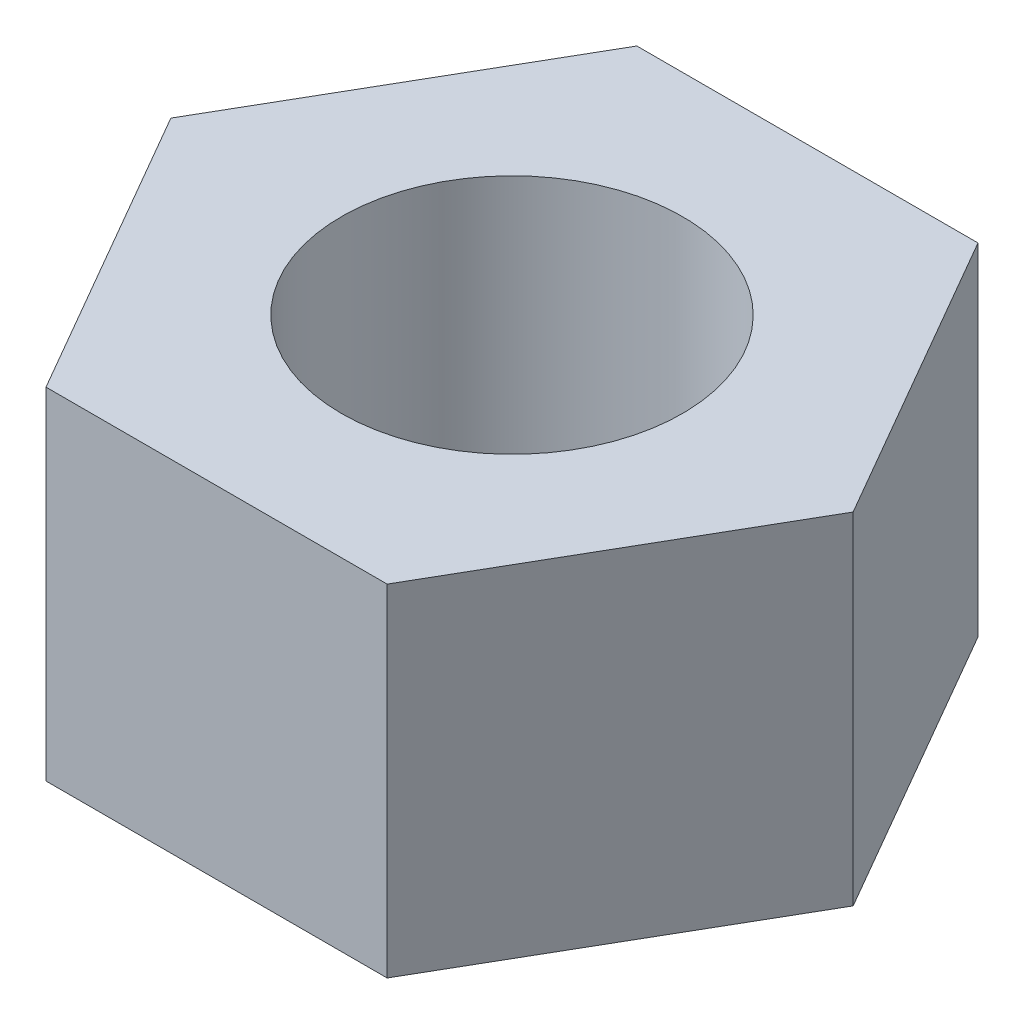
ISO-10303-21;
HEADER;
FILE_DESCRIPTION(('STEP AP214'),'2;1');
FILE_NAME('part.step','',(''),(''),'','','');
FILE_SCHEMA(('AUTOMOTIVE_DESIGN { 1 0 10303 214 1 1 1 1 }'));
ENDSEC;
DATA;
#1=APPLICATION_CONTEXT('core data for automotive mechanical design processes');
#2=APPLICATION_PROTOCOL_DEFINITION('international standard','automotive_design',2000,#1);
#3=PRODUCT_CONTEXT('',#1,'mechanical');
#4=PRODUCT('Part','Part','',(#3));
#5=PRODUCT_RELATED_PRODUCT_CATEGORY('part','',(#4));
#6=PRODUCT_DEFINITION_FORMATION('','',#4);
#7=PRODUCT_DEFINITION_CONTEXT('part definition',#1,'design');
#8=PRODUCT_DEFINITION('design','',#6,#7);
#9=PRODUCT_DEFINITION_SHAPE('','',#8);
#10=(LENGTH_UNIT() NAMED_UNIT(*) SI_UNIT(.MILLI.,.METRE.));
#11=(NAMED_UNIT(*) PLANE_ANGLE_UNIT() SI_UNIT($,.RADIAN.));
#12=(NAMED_UNIT(*) SI_UNIT($,.STERADIAN.) SOLID_ANGLE_UNIT());
#13=UNCERTAINTY_MEASURE_WITH_UNIT(LENGTH_MEASURE(1.E-05),#10,'distance_accuracy_value','');
#14=(GEOMETRIC_REPRESENTATION_CONTEXT(3) GLOBAL_UNCERTAINTY_ASSIGNED_CONTEXT((#13)) GLOBAL_UNIT_ASSIGNED_CONTEXT((#10,
#11,#12)) REPRESENTATION_CONTEXT('',''));
#15=CARTESIAN_POINT('',(0.,0.,0.));
#16=DIRECTION('',(0.,0.,1.));
#17=DIRECTION('',(1.,0.,0.));
#18=AXIS2_PLACEMENT_3D('',#15,#16,#17);
#19=CARTESIAN_POINT('',(0.,20.,0.));
#20=DIRECTION('',(0.,-1.,0.));
#21=DIRECTION('',(0.,0.,-1.));
#22=AXIS2_PLACEMENT_3D('',#19,#20,#21);
#23=PLANE('',#22);
#24=DIRECTION('',(-0.499999999999992,0.,0.866025403784443));
#25=VECTOR('',#24,1.);
#26=CARTESIAN_POINT('',(-10.0000000000003,20.,-17.3205080756887));
#27=LINE('',#26,#25);
#28=CARTESIAN_POINT('',(-10.0000000000003,20.,-17.3205080756887));
#29=VERTEX_POINT('',#28);
#30=CARTESIAN_POINT('',(-20.0000000000001,20.,1.45716771982052E-13));
#31=VERTEX_POINT('',#30);
#32=EDGE_CURVE('E129',#29,#31,#27,.T.);
#33=ORIENTED_EDGE('',*,*,#32,.T.);
#34=DIRECTION('',(0.500000000000018,0.,0.866025403784429));
#35=VECTOR('',#34,1.);
#36=CARTESIAN_POINT('',(-9.99999999999974,20.,17.3205080756887));
#37=LINE('',#36,#35);
#38=CARTESIAN_POINT('',(-9.99999999999974,20.,17.3205080756887));
#39=VERTEX_POINT('',#38);
#40=EDGE_CURVE('E87',#31,#39,#37,.T.);
#41=ORIENTED_EDGE('',*,*,#40,.T.);
#42=DIRECTION('',(1.,0.,0.));
#43=VECTOR('',#42,1.);
#44=CARTESIAN_POINT('',(10.0000000000003,20.,17.3205080756887));
#45=LINE('',#44,#43);
#46=CARTESIAN_POINT('',(10.0000000000003,20.,17.3205080756887));
#47=VERTEX_POINT('',#46);
#48=EDGE_CURVE('E100',#39,#47,#45,.T.);
#49=ORIENTED_EDGE('',*,*,#48,.T.);
#50=DIRECTION('',(0.499999999999992,0.,-0.866025403784443));
#51=VECTOR('',#50,1.);
#52=CARTESIAN_POINT('',(20.0000000000001,20.,-1.45716771982052E-13));
#53=LINE('',#52,#51);
#54=CARTESIAN_POINT('',(20.0000000000001,20.,-1.45716771982052E-13));
#55=VERTEX_POINT('',#54);
#56=EDGE_CURVE('E94',#47,#55,#53,.T.);
#57=ORIENTED_EDGE('',*,*,#56,.T.);
#58=DIRECTION('',(-0.500000000000018,0.,-0.866025403784428));
#59=VECTOR('',#58,1.);
#60=CARTESIAN_POINT('',(9.99999999999974,20.,-17.3205080756887));
#61=LINE('',#60,#59);
#62=CARTESIAN_POINT('',(9.99999999999974,20.,-17.3205080756887));
#63=VERTEX_POINT('',#62);
#64=EDGE_CURVE('E98',#55,#63,#61,.T.);
#65=ORIENTED_EDGE('',*,*,#64,.T.);
#66=DIRECTION('',(-1.,0.,0.));
#67=VECTOR('',#66,1.);
#68=CARTESIAN_POINT('',(-10.0000000000003,20.,-17.3205080756887));
#69=LINE('',#68,#67);
#70=EDGE_CURVE('E50',#63,#29,#69,.T.);
#71=ORIENTED_EDGE('',*,*,#70,.T.);
#72=EDGE_LOOP('',(#33,#41,#49,#57,#65,#71));
#73=FACE_BOUND('',#72,.T.);
#74=CARTESIAN_POINT('',(0.,20.,0.));
#75=DIRECTION('',(0.,1.,0.));
#76=DIRECTION('',(0.,0.,1.));
#77=AXIS2_PLACEMENT_3D('',#74,#75,#76);
#78=CIRCLE('',#77,10.);
#79=CARTESIAN_POINT('',(0.,20.,10.));
#80=VERTEX_POINT('',#79);
#81=EDGE_CURVE('E122',#80,#80,#78,.T.);
#82=ORIENTED_EDGE('',*,*,#81,.F.);
#83=EDGE_LOOP('',(#82));
#84=FACE_BOUND('',#83,.T.);
#85=ADVANCED_FACE('F33',(#73,#84),#23,.F.);
#86=CARTESIAN_POINT('',(0.,0.,0.));
#87=DIRECTION('',(0.,-1.,0.));
#88=DIRECTION('',(0.,0.,-1.));
#89=AXIS2_PLACEMENT_3D('',#86,#87,#88);
#90=PLANE('',#89);
#91=DIRECTION('',(-0.499999999999992,0.,0.866025403784443));
#92=VECTOR('',#91,1.);
#93=CARTESIAN_POINT('',(-10.0000000000003,0.,-17.3205080756887));
#94=LINE('',#93,#92);
#95=CARTESIAN_POINT('',(-10.0000000000003,0.,-17.3205080756887));
#96=VERTEX_POINT('',#95);
#97=CARTESIAN_POINT('',(-20.0000000000001,0.,1.45716771982052E-13));
#98=VERTEX_POINT('',#97);
#99=EDGE_CURVE('E118',#96,#98,#94,.T.);
#100=ORIENTED_EDGE('',*,*,#99,.F.);
#101=DIRECTION('',(-1.,0.,0.));
#102=VECTOR('',#101,1.);
#103=CARTESIAN_POINT('',(-10.0000000000003,0.,-17.3205080756887));
#104=LINE('',#103,#102);
#105=CARTESIAN_POINT('',(9.99999999999974,0.,-17.3205080756887));
#106=VERTEX_POINT('',#105);
#107=EDGE_CURVE('E79',#106,#96,#104,.T.);
#108=ORIENTED_EDGE('',*,*,#107,.F.);
#109=DIRECTION('',(-0.500000000000018,0.,-0.866025403784428));
#110=VECTOR('',#109,1.);
#111=CARTESIAN_POINT('',(9.99999999999974,0.,-17.3205080756887));
#112=LINE('',#111,#110);
#113=CARTESIAN_POINT('',(20.0000000000001,0.,-1.45716771982052E-13));
#114=VERTEX_POINT('',#113);
#115=EDGE_CURVE('E73',#114,#106,#112,.T.);
#116=ORIENTED_EDGE('',*,*,#115,.F.);
#117=DIRECTION('',(0.499999999999992,0.,-0.866025403784443));
#118=VECTOR('',#117,1.);
#119=CARTESIAN_POINT('',(20.0000000000001,0.,-1.45716771982052E-13));
#120=LINE('',#119,#118);
#121=CARTESIAN_POINT('',(10.0000000000003,0.,17.3205080756887));
#122=VERTEX_POINT('',#121);
#123=EDGE_CURVE('E108',#122,#114,#120,.T.);
#124=ORIENTED_EDGE('',*,*,#123,.F.);
#125=DIRECTION('',(1.,0.,0.));
#126=VECTOR('',#125,1.);
#127=CARTESIAN_POINT('',(10.0000000000003,0.,17.3205080756887));
#128=LINE('',#127,#126);
#129=CARTESIAN_POINT('',(-9.99999999999974,0.,17.3205080756887));
#130=VERTEX_POINT('',#129);
#131=EDGE_CURVE('E124',#130,#122,#128,.T.);
#132=ORIENTED_EDGE('',*,*,#131,.F.);
#133=DIRECTION('',(0.500000000000018,0.,0.866025403784429));
#134=VECTOR('',#133,1.);
#135=CARTESIAN_POINT('',(-9.99999999999974,0.,17.3205080756887));
#136=LINE('',#135,#134);
#137=EDGE_CURVE('E121',#98,#130,#136,.T.);
#138=ORIENTED_EDGE('',*,*,#137,.F.);
#139=EDGE_LOOP('',(#100,#108,#116,#124,#132,#138));
#140=FACE_BOUND('',#139,.T.);
#141=CARTESIAN_POINT('',(0.,0.,0.));
#142=DIRECTION('',(0.,1.,0.));
#143=DIRECTION('',(0.,0.,1.));
#144=AXIS2_PLACEMENT_3D('',#141,#142,#143);
#145=CIRCLE('',#144,10.);
#146=CARTESIAN_POINT('',(0.,0.,10.));
#147=VERTEX_POINT('',#146);
#148=EDGE_CURVE('E222',#147,#147,#145,.T.);
#149=ORIENTED_EDGE('',*,*,#148,.T.);
#150=EDGE_LOOP('',(#149));
#151=FACE_BOUND('',#150,.T.);
#152=ADVANCED_FACE('F138',(#140,#151),#90,.T.);
#153=CARTESIAN_POINT('',(-10.0000000000003,20.,-17.3205080756887));
#154=DIRECTION('',(0.866025403784443,0.,0.499999999999992));
#155=DIRECTION('',(0.499999999999992,0.,-0.866025403784443));
#156=AXIS2_PLACEMENT_3D('',#153,#154,#155);
#157=PLANE('',#156);
#158=ORIENTED_EDGE('',*,*,#99,.T.);
#159=DIRECTION('',(0.,-1.,0.));
#160=VECTOR('',#159,1.);
#161=CARTESIAN_POINT('',(-20.0000000000001,20.,1.45716771982052E-13));
#162=LINE('',#161,#160);
#163=EDGE_CURVE('E11',#31,#98,#162,.T.);
#164=ORIENTED_EDGE('',*,*,#163,.F.);
#165=ORIENTED_EDGE('',*,*,#32,.F.);
#166=DIRECTION('',(0.,-1.,0.));
#167=VECTOR('',#166,1.);
#168=CARTESIAN_POINT('',(-10.0000000000003,20.,-17.3205080756887));
#169=LINE('',#168,#167);
#170=EDGE_CURVE('E114',#29,#96,#169,.T.);
#171=ORIENTED_EDGE('',*,*,#170,.T.);
#172=EDGE_LOOP('',(#158,#164,#165,#171));
#173=FACE_BOUND('',#172,.T.);
#174=ADVANCED_FACE('F35',(#173),#157,.F.);
#175=CARTESIAN_POINT('',(-9.99999999999974,20.,17.3205080756887));
#176=DIRECTION('',(0.866025403784429,0.,-0.500000000000018));
#177=DIRECTION('',(-0.500000000000018,0.,-0.866025403784429));
#178=AXIS2_PLACEMENT_3D('',#175,#176,#177);
#179=PLANE('',#178);
#180=ORIENTED_EDGE('',*,*,#137,.T.);
#181=DIRECTION('',(0.,-1.,0.));
#182=VECTOR('',#181,1.);
#183=CARTESIAN_POINT('',(-9.99999999999974,20.,17.3205080756887));
#184=LINE('',#183,#182);
#185=EDGE_CURVE('E42',#39,#130,#184,.T.);
#186=ORIENTED_EDGE('',*,*,#185,.F.);
#187=ORIENTED_EDGE('',*,*,#40,.F.);
#188=ORIENTED_EDGE('',*,*,#163,.T.);
#189=EDGE_LOOP('',(#180,#186,#187,#188));
#190=FACE_BOUND('',#189,.T.);
#191=ADVANCED_FACE('F163',(#190),#179,.F.);
#192=CARTESIAN_POINT('',(10.0000000000003,20.,17.3205080756887));
#193=DIRECTION('',(0.,0.,-1.));
#194=DIRECTION('',(-1.,0.,0.));
#195=AXIS2_PLACEMENT_3D('',#192,#193,#194);
#196=PLANE('',#195);
#197=ORIENTED_EDGE('',*,*,#131,.T.);
#198=DIRECTION('',(0.,-1.,0.));
#199=VECTOR('',#198,1.);
#200=CARTESIAN_POINT('',(10.0000000000003,20.,17.3205080756887));
#201=LINE('',#200,#199);
#202=EDGE_CURVE('E109',#47,#122,#201,.T.);
#203=ORIENTED_EDGE('',*,*,#202,.F.);
#204=ORIENTED_EDGE('',*,*,#48,.F.);
#205=ORIENTED_EDGE('',*,*,#185,.T.);
#206=EDGE_LOOP('',(#197,#203,#204,#205));
#207=FACE_BOUND('',#206,.T.);
#208=ADVANCED_FACE('F135',(#207),#196,.F.);
#209=CARTESIAN_POINT('',(20.0000000000001,20.,-1.45716771982052E-13));
#210=DIRECTION('',(-0.866025403784443,0.,-0.499999999999992));
#211=DIRECTION('',(-0.499999999999992,0.,0.866025403784443));
#212=AXIS2_PLACEMENT_3D('',#209,#210,#211);
#213=PLANE('',#212);
#214=ORIENTED_EDGE('',*,*,#123,.T.);
#215=DIRECTION('',(0.,-1.,0.));
#216=VECTOR('',#215,1.);
#217=CARTESIAN_POINT('',(20.0000000000001,20.,-1.45716771982052E-13));
#218=LINE('',#217,#216);
#219=EDGE_CURVE('E105',#55,#114,#218,.T.);
#220=ORIENTED_EDGE('',*,*,#219,.F.);
#221=ORIENTED_EDGE('',*,*,#56,.F.);
#222=ORIENTED_EDGE('',*,*,#202,.T.);
#223=EDGE_LOOP('',(#214,#220,#221,#222));
#224=FACE_BOUND('',#223,.T.);
#225=ADVANCED_FACE('F106',(#224),#213,.F.);
#226=CARTESIAN_POINT('',(9.99999999999974,20.,-17.3205080756887));
#227=DIRECTION('',(-0.866025403784428,0.,0.500000000000018));
#228=DIRECTION('',(0.500000000000018,0.,0.866025403784429));
#229=AXIS2_PLACEMENT_3D('',#226,#227,#228);
#230=PLANE('',#229);
#231=ORIENTED_EDGE('',*,*,#115,.T.);
#232=DIRECTION('',(0.,-1.,0.));
#233=VECTOR('',#232,1.);
#234=CARTESIAN_POINT('',(9.99999999999974,20.,-17.3205080756887));
#235=LINE('',#234,#233);
#236=EDGE_CURVE('E110',#63,#106,#235,.T.);
#237=ORIENTED_EDGE('',*,*,#236,.F.);
#238=ORIENTED_EDGE('',*,*,#64,.F.);
#239=ORIENTED_EDGE('',*,*,#219,.T.);
#240=EDGE_LOOP('',(#231,#237,#238,#239));
#241=FACE_BOUND('',#240,.T.);
#242=ADVANCED_FACE('F112',(#241),#230,.F.);
#243=CARTESIAN_POINT('',(-10.0000000000003,20.,-17.3205080756887));
#244=DIRECTION('',(0.,0.,1.));
#245=DIRECTION('',(1.,0.,0.));
#246=AXIS2_PLACEMENT_3D('',#243,#244,#245);
#247=PLANE('',#246);
#248=ORIENTED_EDGE('',*,*,#107,.T.);
#249=ORIENTED_EDGE('',*,*,#170,.F.);
#250=ORIENTED_EDGE('',*,*,#70,.F.);
#251=ORIENTED_EDGE('',*,*,#236,.T.);
#252=EDGE_LOOP('',(#248,#249,#250,#251));
#253=FACE_BOUND('',#252,.T.);
#254=ADVANCED_FACE('F143',(#253),#247,.F.);
#255=CARTESIAN_POINT('',(0.,20.,0.));
#256=DIRECTION('',(0.,-1.,0.));
#257=DIRECTION('',(0.,0.,-1.));
#258=AXIS2_PLACEMENT_3D('',#255,#256,#257);
#259=CYLINDRICAL_SURFACE('',#258,10.);
#260=ORIENTED_EDGE('',*,*,#81,.T.);
#261=EDGE_LOOP('',(#260));
#262=FACE_BOUND('',#261,.T.);
#263=ORIENTED_EDGE('',*,*,#148,.F.);
#264=EDGE_LOOP('',(#263));
#265=FACE_BOUND('',#264,.T.);
#266=ADVANCED_FACE('F145',(#262,#265),#259,.F.);
#267=CLOSED_SHELL('',(#85,#152,#174,#191,#208,#225,#242,#254,#266));
#268=MANIFOLD_SOLID_BREP('B2',#267);
#269=ADVANCED_BREP_SHAPE_REPRESENTATION('',(#18,#268),#14);
#270=SHAPE_DEFINITION_REPRESENTATION(#9,#269);
ENDSEC;
END-ISO-10303-21;
